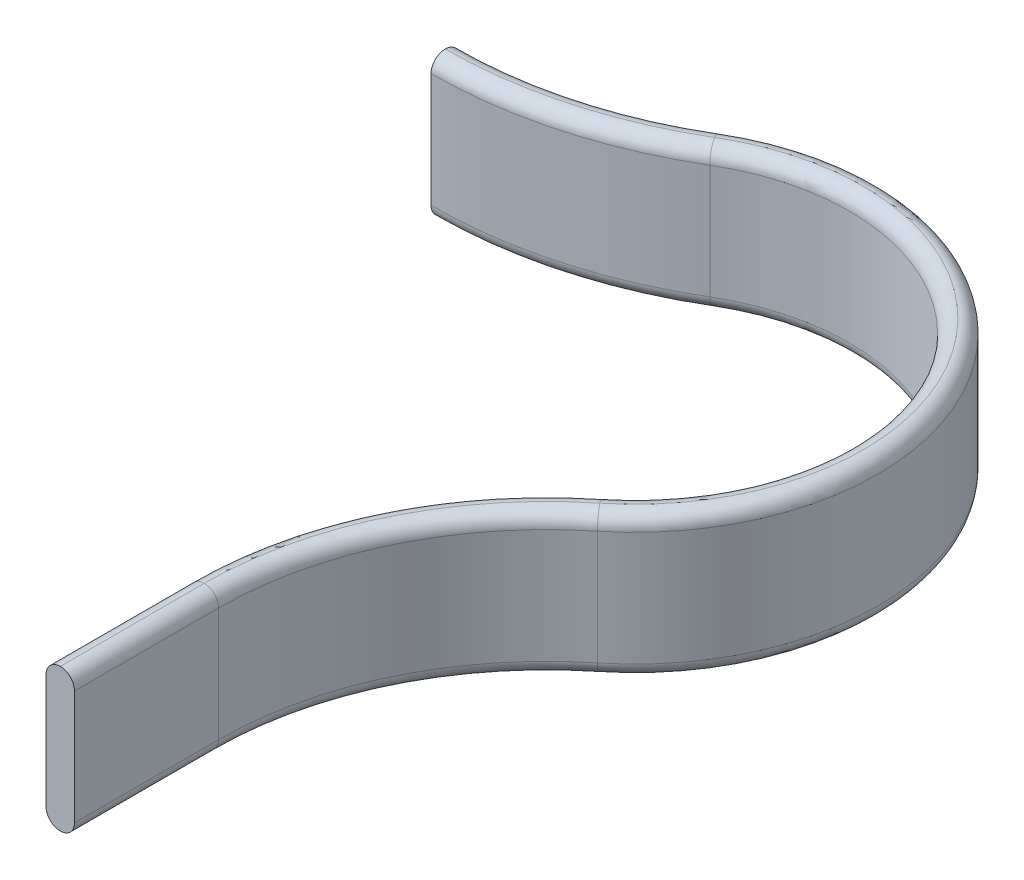
ISO-10303-21;
HEADER;
FILE_DESCRIPTION(('STEP AP214'),'2;1');
FILE_NAME('part.step','',(''),(''),'','','');
FILE_SCHEMA(('AUTOMOTIVE_DESIGN { 1 0 10303 214 1 1 1 1 }'));
ENDSEC;
DATA;
#1=APPLICATION_CONTEXT('core data for automotive mechanical design processes');
#2=APPLICATION_PROTOCOL_DEFINITION('international standard','automotive_design',2000,#1);
#3=PRODUCT_CONTEXT('',#1,'mechanical');
#4=PRODUCT('Part','Part','',(#3));
#5=PRODUCT_RELATED_PRODUCT_CATEGORY('part','',(#4));
#6=PRODUCT_DEFINITION_FORMATION('','',#4);
#7=PRODUCT_DEFINITION_CONTEXT('part definition',#1,'design');
#8=PRODUCT_DEFINITION('design','',#6,#7);
#9=PRODUCT_DEFINITION_SHAPE('','',#8);
#10=(LENGTH_UNIT() NAMED_UNIT(*) SI_UNIT(.MILLI.,.METRE.));
#11=(NAMED_UNIT(*) PLANE_ANGLE_UNIT() SI_UNIT($,.RADIAN.));
#12=(NAMED_UNIT(*) SI_UNIT($,.STERADIAN.) SOLID_ANGLE_UNIT());
#13=UNCERTAINTY_MEASURE_WITH_UNIT(LENGTH_MEASURE(1.E-05),#10,'distance_accuracy_value','');
#14=(GEOMETRIC_REPRESENTATION_CONTEXT(3) GLOBAL_UNCERTAINTY_ASSIGNED_CONTEXT((#13)) GLOBAL_UNIT_ASSIGNED_CONTEXT((#10,
#11,#12)) REPRESENTATION_CONTEXT('',''));
#15=CARTESIAN_POINT('',(0.,0.,0.));
#16=DIRECTION('',(0.,0.,1.));
#17=DIRECTION('',(1.,0.,0.));
#18=AXIS2_PLACEMENT_3D('',#15,#16,#17);
#19=CARTESIAN_POINT('',(50.,10.,79.8062984072389));
#20=DIRECTION('',(0.,-1.,0.));
#21=DIRECTION('',(0.,0.,-1.));
#22=AXIS2_PLACEMENT_3D('',#19,#20,#21);
#23=CYLINDRICAL_SURFACE('',#22,46.);
#24=DIRECTION('',(0.,-1.,0.));
#25=VECTOR('',#24,1.);
#26=CARTESIAN_POINT('',(4.00000000000001,10.,79.8062984072389));
#27=LINE('',#26,#25);
#28=CARTESIAN_POINT('',(4.00000000000001,8.,79.8062984072389));
#29=VERTEX_POINT('',#28);
#30=CARTESIAN_POINT('',(4.00000000000001,-8.,79.8062984072389));
#31=VERTEX_POINT('',#30);
#32=EDGE_CURVE('E146',#29,#31,#27,.T.);
#33=ORIENTED_EDGE('',*,*,#32,.T.);
#34=CARTESIAN_POINT('',(50.,-8.,79.8062984072389));
#35=DIRECTION('',(0.,-1.,0.));
#36=DIRECTION('',(0.,0.,-1.));
#37=AXIS2_PLACEMENT_3D('',#34,#35,#36);
#38=CIRCLE('',#37,46.);
#39=CARTESIAN_POINT('',(21.25,-8.,43.8975599164481));
#40=VERTEX_POINT('',#39);
#41=EDGE_CURVE('E211',#31,#40,#38,.T.);
#42=ORIENTED_EDGE('',*,*,#41,.T.);
#43=DIRECTION('',(0.,-1.,0.));
#44=VECTOR('',#43,1.);
#45=CARTESIAN_POINT('',(21.25,10.,43.8975599164481));
#46=LINE('',#45,#44);
#47=CARTESIAN_POINT('',(21.25,8.,43.8975599164481));
#48=VERTEX_POINT('',#47);
#49=EDGE_CURVE('E267',#48,#40,#46,.T.);
#50=ORIENTED_EDGE('',*,*,#49,.F.);
#51=CARTESIAN_POINT('',(50.,8.,79.8062984072389));
#52=DIRECTION('',(0.,-1.,0.));
#53=DIRECTION('',(0.,0.,-1.));
#54=AXIS2_PLACEMENT_3D('',#51,#52,#53);
#55=CIRCLE('',#54,46.);
#56=EDGE_CURVE('E215',#48,#29,#55,.F.);
#57=ORIENTED_EDGE('',*,*,#56,.T.);
#58=EDGE_LOOP('',(#33,#42,#50,#57));
#59=FACE_BOUND('',#58,.T.);
#60=ADVANCED_FACE('F39',(#59),#23,.F.);
#61=CARTESIAN_POINT('',(0.,10.,17.3563184232549));
#62=DIRECTION('',(0.,-1.,0.));
#63=DIRECTION('',(0.,0.,-1.));
#64=AXIS2_PLACEMENT_3D('',#61,#62,#63);
#65=CYLINDRICAL_SURFACE('',#64,34.);
#66=ORIENTED_EDGE('',*,*,#49,.T.);
#67=CARTESIAN_POINT('',(0.,-8.,17.3563184232549));
#68=DIRECTION('',(0.,-1.,0.));
#69=DIRECTION('',(0.,0.,-1.));
#70=AXIS2_PLACEMENT_3D('',#67,#68,#69);
#71=CIRCLE('',#70,34.);
#72=CARTESIAN_POINT('',(-17.3777777777778,-8.,-11.8671796477525));
#73=VERTEX_POINT('',#72);
#74=EDGE_CURVE('E205',#40,#73,#71,.F.);
#75=ORIENTED_EDGE('',*,*,#74,.T.);
#76=DIRECTION('',(0.,-1.,0.));
#77=VECTOR('',#76,1.);
#78=CARTESIAN_POINT('',(-17.3777777777778,10.,-11.8671796477525));
#79=LINE('',#78,#77);
#80=CARTESIAN_POINT('',(-17.3777777777778,8.,-11.8671796477525));
#81=VERTEX_POINT('',#80);
#82=EDGE_CURVE('E271',#81,#73,#79,.T.);
#83=ORIENTED_EDGE('',*,*,#82,.F.);
#84=CARTESIAN_POINT('',(0.,8.,17.3563184232549));
#85=DIRECTION('',(0.,-1.,0.));
#86=DIRECTION('',(0.,0.,-1.));
#87=AXIS2_PLACEMENT_3D('',#84,#85,#86);
#88=CIRCLE('',#87,34.);
#89=EDGE_CURVE('E101',#81,#48,#88,.T.);
#90=ORIENTED_EDGE('',*,*,#89,.T.);
#91=EDGE_LOOP('',(#66,#75,#83,#90));
#92=FACE_BOUND('',#91,.T.);
#93=ADVANCED_FACE('F412',(#92),#65,.T.);
#94=CARTESIAN_POINT('',(-46.,10.,-60.));
#95=DIRECTION('',(0.,-1.,0.));
#96=DIRECTION('',(0.,0.,-1.));
#97=AXIS2_PLACEMENT_3D('',#94,#95,#96);
#98=CYLINDRICAL_SURFACE('',#97,56.);
#99=ORIENTED_EDGE('',*,*,#82,.T.);
#100=CARTESIAN_POINT('',(-46.,-8.,-60.));
#101=DIRECTION('',(0.,-1.,0.));
#102=DIRECTION('',(0.,0.,-1.));
#103=AXIS2_PLACEMENT_3D('',#100,#101,#102);
#104=CIRCLE('',#103,56.);
#105=CARTESIAN_POINT('',(-46.,-8.,-4.));
#106=VERTEX_POINT('',#105);
#107=EDGE_CURVE('E11',#73,#106,#104,.T.);
#108=ORIENTED_EDGE('',*,*,#107,.T.);
#109=DIRECTION('',(0.,-1.,0.));
#110=VECTOR('',#109,1.);
#111=CARTESIAN_POINT('',(-46.,10.,-4.));
#112=LINE('',#111,#110);
#113=CARTESIAN_POINT('',(-46.,8.,-4.));
#114=VERTEX_POINT('',#113);
#115=EDGE_CURVE('E274',#114,#106,#112,.T.);
#116=ORIENTED_EDGE('',*,*,#115,.F.);
#117=CARTESIAN_POINT('',(-46.,8.,-60.));
#118=DIRECTION('',(0.,-1.,0.));
#119=DIRECTION('',(0.,0.,-1.));
#120=AXIS2_PLACEMENT_3D('',#117,#118,#119);
#121=CIRCLE('',#120,56.);
#122=EDGE_CURVE('E50',#114,#81,#121,.F.);
#123=ORIENTED_EDGE('',*,*,#122,.T.);
#124=EDGE_LOOP('',(#99,#108,#116,#123));
#125=FACE_BOUND('',#124,.T.);
#126=ADVANCED_FACE('F417',(#125),#98,.F.);
#127=CARTESIAN_POINT('',(-46.,10.,-4.));
#128=DIRECTION('',(1.,0.,0.));
#129=DIRECTION('',(0.,0.,-1.));
#130=AXIS2_PLACEMENT_3D('',#127,#128,#129);
#131=PLANE('',#130);
#132=CARTESIAN_POINT('',(-45.9999999999997,-8.,-1.99999999999999));
#133=DIRECTION('',(1.,0.,0.));
#134=DIRECTION('',(0.,0.,-1.));
#135=AXIS2_PLACEMENT_3D('',#132,#133,#134);
#136=CIRCLE('',#135,2.);
#137=CARTESIAN_POINT('',(-46.,-10.,-1.99999999999999));
#138=VERTEX_POINT('',#137);
#139=EDGE_CURVE('E189',#106,#138,#136,.F.);
#140=ORIENTED_EDGE('',*,*,#139,.T.);
#141=CARTESIAN_POINT('',(-45.9999999999997,-8.,-1.99999999999999));
#142=DIRECTION('',(1.,0.,0.));
#143=DIRECTION('',(0.,0.,-1.));
#144=AXIS2_PLACEMENT_3D('',#141,#142,#143);
#145=CIRCLE('',#144,2.);
#146=CARTESIAN_POINT('',(-46.,-8.,0.));
#147=VERTEX_POINT('',#146);
#148=EDGE_CURVE('E185',#138,#147,#145,.F.);
#149=ORIENTED_EDGE('',*,*,#148,.T.);
#150=DIRECTION('',(0.,-1.,0.));
#151=VECTOR('',#150,1.);
#152=CARTESIAN_POINT('',(-46.,10.,0.));
#153=LINE('',#152,#151);
#154=CARTESIAN_POINT('',(-46.,8.,0.));
#155=VERTEX_POINT('',#154);
#156=EDGE_CURVE('E277',#155,#147,#153,.T.);
#157=ORIENTED_EDGE('',*,*,#156,.F.);
#158=CARTESIAN_POINT('',(-45.9999999999997,8.,-1.99999999999999));
#159=DIRECTION('',(1.,0.,0.));
#160=DIRECTION('',(0.,0.,-1.));
#161=AXIS2_PLACEMENT_3D('',#158,#159,#160);
#162=CIRCLE('',#161,2.);
#163=CARTESIAN_POINT('',(-46.,10.,-1.99999999999999));
#164=VERTEX_POINT('',#163);
#165=EDGE_CURVE('E193',#155,#164,#162,.F.);
#166=ORIENTED_EDGE('',*,*,#165,.T.);
#167=CARTESIAN_POINT('',(-45.9999999999997,8.,-1.99999999999999));
#168=DIRECTION('',(1.,0.,0.));
#169=DIRECTION('',(0.,0.,-1.));
#170=AXIS2_PLACEMENT_3D('',#167,#168,#169);
#171=CIRCLE('',#170,2.);
#172=EDGE_CURVE('E93',#164,#114,#171,.F.);
#173=ORIENTED_EDGE('',*,*,#172,.T.);
#174=ORIENTED_EDGE('',*,*,#115,.T.);
#175=EDGE_LOOP('',(#140,#149,#157,#166,#173,#174));
#176=FACE_BOUND('',#175,.T.);
#177=ADVANCED_FACE('F368',(#176),#131,.F.);
#178=CARTESIAN_POINT('',(-46.,10.,-60.));
#179=DIRECTION('',(0.,-1.,0.));
#180=DIRECTION('',(0.,0.,-1.));
#181=AXIS2_PLACEMENT_3D('',#178,#179,#180);
#182=CYLINDRICAL_SURFACE('',#181,60.);
#183=ORIENTED_EDGE('',*,*,#156,.T.);
#184=CARTESIAN_POINT('',(-46.,-8.,-60.));
#185=DIRECTION('',(0.,-1.,0.));
#186=DIRECTION('',(0.,0.,-1.));
#187=AXIS2_PLACEMENT_3D('',#184,#185,#186);
#188=CIRCLE('',#187,60.);
#189=CARTESIAN_POINT('',(-15.3333333333333,-8.,-8.42912105116342));
#190=VERTEX_POINT('',#189);
#191=EDGE_CURVE('E199',#147,#190,#188,.F.);
#192=ORIENTED_EDGE('',*,*,#191,.T.);
#193=DIRECTION('',(0.,-1.,0.));
#194=VECTOR('',#193,1.);
#195=CARTESIAN_POINT('',(-15.3333333333333,10.,-8.42912105116342));
#196=LINE('',#195,#194);
#197=CARTESIAN_POINT('',(-15.3333333333333,8.,-8.42912105116342));
#198=VERTEX_POINT('',#197);
#199=EDGE_CURVE('E281',#198,#190,#196,.T.);
#200=ORIENTED_EDGE('',*,*,#199,.F.);
#201=CARTESIAN_POINT('',(-46.,8.,-60.));
#202=DIRECTION('',(0.,-1.,0.));
#203=DIRECTION('',(0.,0.,-1.));
#204=AXIS2_PLACEMENT_3D('',#201,#202,#203);
#205=CIRCLE('',#204,60.);
#206=EDGE_CURVE('E109',#198,#155,#205,.T.);
#207=ORIENTED_EDGE('',*,*,#206,.T.);
#208=EDGE_LOOP('',(#183,#192,#200,#207));
#209=FACE_BOUND('',#208,.T.);
#210=ADVANCED_FACE('F372',(#209),#182,.T.);
#211=CARTESIAN_POINT('',(0.,10.,17.3563184232549));
#212=DIRECTION('',(0.,-1.,0.));
#213=DIRECTION('',(0.,0.,-1.));
#214=AXIS2_PLACEMENT_3D('',#211,#212,#213);
#215=CYLINDRICAL_SURFACE('',#214,30.);
#216=ORIENTED_EDGE('',*,*,#199,.T.);
#217=CARTESIAN_POINT('',(0.,-8.,17.3563184232549));
#218=DIRECTION('',(0.,-1.,0.));
#219=DIRECTION('',(0.,0.,-1.));
#220=AXIS2_PLACEMENT_3D('',#217,#218,#219);
#221=CIRCLE('',#220,30.);
#222=CARTESIAN_POINT('',(18.75,-8.,40.7750609172489));
#223=VERTEX_POINT('',#222);
#224=EDGE_CURVE('E227',#190,#223,#221,.T.);
#225=ORIENTED_EDGE('',*,*,#224,.T.);
#226=DIRECTION('',(0.,-1.,0.));
#227=VECTOR('',#226,1.);
#228=CARTESIAN_POINT('',(18.75,10.,40.7750609172489));
#229=LINE('',#228,#227);
#230=CARTESIAN_POINT('',(18.75,8.,40.7750609172489));
#231=VERTEX_POINT('',#230);
#232=EDGE_CURVE('E285',#231,#223,#229,.T.);
#233=ORIENTED_EDGE('',*,*,#232,.F.);
#234=CARTESIAN_POINT('',(0.,8.,17.3563184232549));
#235=DIRECTION('',(0.,-1.,0.));
#236=DIRECTION('',(0.,0.,-1.));
#237=AXIS2_PLACEMENT_3D('',#234,#235,#236);
#238=CIRCLE('',#237,30.);
#239=EDGE_CURVE('E231',#231,#198,#238,.F.);
#240=ORIENTED_EDGE('',*,*,#239,.T.);
#241=EDGE_LOOP('',(#216,#225,#233,#240));
#242=FACE_BOUND('',#241,.T.);
#243=ADVANCED_FACE('F385',(#242),#215,.F.);
#244=CARTESIAN_POINT('',(50.,10.,79.8062984072389));
#245=DIRECTION('',(0.,-1.,0.));
#246=DIRECTION('',(0.,0.,-1.));
#247=AXIS2_PLACEMENT_3D('',#244,#245,#246);
#248=CYLINDRICAL_SURFACE('',#247,50.);
#249=ORIENTED_EDGE('',*,*,#232,.T.);
#250=CARTESIAN_POINT('',(50.,-8.,79.8062984072389));
#251=DIRECTION('',(0.,-1.,0.));
#252=DIRECTION('',(0.,0.,-1.));
#253=AXIS2_PLACEMENT_3D('',#250,#251,#252);
#254=CIRCLE('',#253,50.);
#255=CARTESIAN_POINT('',(0.,-8.,79.8062984072389));
#256=VERTEX_POINT('',#255);
#257=EDGE_CURVE('E235',#223,#256,#254,.F.);
#258=ORIENTED_EDGE('',*,*,#257,.T.);
#259=DIRECTION('',(0.,-1.,0.));
#260=VECTOR('',#259,1.);
#261=CARTESIAN_POINT('',(0.,10.,79.8062984072389));
#262=LINE('',#261,#260);
#263=CARTESIAN_POINT('',(0.,8.,79.8062984072389));
#264=VERTEX_POINT('',#263);
#265=EDGE_CURVE('E289',#264,#256,#262,.T.);
#266=ORIENTED_EDGE('',*,*,#265,.F.);
#267=CARTESIAN_POINT('',(50.,8.,79.8062984072389));
#268=DIRECTION('',(0.,-1.,0.));
#269=DIRECTION('',(0.,0.,-1.));
#270=AXIS2_PLACEMENT_3D('',#267,#268,#269);
#271=CIRCLE('',#270,50.);
#272=EDGE_CURVE('E239',#264,#231,#271,.T.);
#273=ORIENTED_EDGE('',*,*,#272,.T.);
#274=EDGE_LOOP('',(#249,#258,#266,#273));
#275=FACE_BOUND('',#274,.T.);
#276=ADVANCED_FACE('F386',(#275),#248,.T.);
#277=CARTESIAN_POINT('',(0.,10.,79.8062984072389));
#278=DIRECTION('',(1.,0.,0.));
#279=DIRECTION('',(0.,0.,-1.));
#280=AXIS2_PLACEMENT_3D('',#277,#278,#279);
#281=PLANE('',#280);
#282=ORIENTED_EDGE('',*,*,#265,.T.);
#283=DIRECTION('',(0.,0.,1.));
#284=VECTOR('',#283,1.);
#285=CARTESIAN_POINT('',(0.,-8.,100.));
#286=LINE('',#285,#284);
#287=CARTESIAN_POINT('',(0.,-8.,100.));
#288=VERTEX_POINT('',#287);
#289=EDGE_CURVE('E259',#256,#288,#286,.T.);
#290=ORIENTED_EDGE('',*,*,#289,.T.);
#291=DIRECTION('',(0.,-1.,0.));
#292=VECTOR('',#291,1.);
#293=CARTESIAN_POINT('',(0.,10.,100.));
#294=LINE('',#293,#292);
#295=CARTESIAN_POINT('',(0.,8.,100.));
#296=VERTEX_POINT('',#295);
#297=EDGE_CURVE('E293',#296,#288,#294,.T.);
#298=ORIENTED_EDGE('',*,*,#297,.F.);
#299=DIRECTION('',(0.,0.,1.));
#300=VECTOR('',#299,1.);
#301=CARTESIAN_POINT('',(0.,8.,79.8062984072389));
#302=LINE('',#301,#300);
#303=EDGE_CURVE('E263',#296,#264,#302,.F.);
#304=ORIENTED_EDGE('',*,*,#303,.T.);
#305=EDGE_LOOP('',(#282,#290,#298,#304));
#306=FACE_BOUND('',#305,.T.);
#307=ADVANCED_FACE('F394',(#306),#281,.F.);
#308=CARTESIAN_POINT('',(0.,10.,100.));
#309=DIRECTION('',(0.,0.,-1.));
#310=DIRECTION('',(-1.,0.,0.));
#311=AXIS2_PLACEMENT_3D('',#308,#309,#310);
#312=PLANE('',#311);
#313=ORIENTED_EDGE('',*,*,#297,.T.);
#314=CARTESIAN_POINT('',(2.00000000000001,-8.,100.));
#315=DIRECTION('',(0.,0.,-1.));
#316=DIRECTION('',(-1.,0.,0.));
#317=AXIS2_PLACEMENT_3D('',#314,#315,#316);
#318=CIRCLE('',#317,2.);
#319=CARTESIAN_POINT('',(2.00000000000001,-10.,100.));
#320=VERTEX_POINT('',#319);
#321=EDGE_CURVE('E243',#288,#320,#318,.F.);
#322=ORIENTED_EDGE('',*,*,#321,.T.);
#323=CARTESIAN_POINT('',(2.00000000000001,-8.,100.));
#324=DIRECTION('',(0.,0.,-1.));
#325=DIRECTION('',(-1.,0.,0.));
#326=AXIS2_PLACEMENT_3D('',#323,#324,#325);
#327=CIRCLE('',#326,2.);
#328=CARTESIAN_POINT('',(4.00000000000001,-8.,100.));
#329=VERTEX_POINT('',#328);
#330=EDGE_CURVE('E247',#320,#329,#327,.F.);
#331=ORIENTED_EDGE('',*,*,#330,.T.);
#332=DIRECTION('',(0.,-1.,0.));
#333=VECTOR('',#332,1.);
#334=CARTESIAN_POINT('',(4.00000000000001,10.,100.));
#335=LINE('',#334,#333);
#336=CARTESIAN_POINT('',(4.00000000000001,8.,100.));
#337=VERTEX_POINT('',#336);
#338=EDGE_CURVE('E297',#337,#329,#335,.T.);
#339=ORIENTED_EDGE('',*,*,#338,.F.);
#340=CARTESIAN_POINT('',(2.00000000000001,8.,100.));
#341=DIRECTION('',(0.,0.,-1.));
#342=DIRECTION('',(-1.,0.,0.));
#343=AXIS2_PLACEMENT_3D('',#340,#341,#342);
#344=CIRCLE('',#343,2.);
#345=CARTESIAN_POINT('',(2.00000000000001,10.,100.));
#346=VERTEX_POINT('',#345);
#347=EDGE_CURVE('E255',#337,#346,#344,.F.);
#348=ORIENTED_EDGE('',*,*,#347,.T.);
#349=CARTESIAN_POINT('',(2.00000000000001,8.,100.));
#350=DIRECTION('',(0.,0.,-1.));
#351=DIRECTION('',(-1.,0.,0.));
#352=AXIS2_PLACEMENT_3D('',#349,#350,#351);
#353=CIRCLE('',#352,2.);
#354=EDGE_CURVE('E251',#346,#296,#353,.F.);
#355=ORIENTED_EDGE('',*,*,#354,.T.);
#356=EDGE_LOOP('',(#313,#322,#331,#339,#348,#355));
#357=FACE_BOUND('',#356,.T.);
#358=ADVANCED_FACE('F400',(#357),#312,.F.);
#359=CARTESIAN_POINT('',(4.00000000000001,10.,79.8062984072389));
#360=DIRECTION('',(-1.,0.,0.));
#361=DIRECTION('',(0.,0.,1.));
#362=AXIS2_PLACEMENT_3D('',#359,#360,#361);
#363=PLANE('',#362);
#364=ORIENTED_EDGE('',*,*,#338,.T.);
#365=DIRECTION('',(0.,0.,-1.));
#366=VECTOR('',#365,1.);
#367=CARTESIAN_POINT('',(4.00000000000001,-8.,79.8062984072389));
#368=LINE('',#367,#366);
#369=EDGE_CURVE('E219',#329,#31,#368,.T.);
#370=ORIENTED_EDGE('',*,*,#369,.T.);
#371=ORIENTED_EDGE('',*,*,#32,.F.);
#372=DIRECTION('',(0.,0.,-1.));
#373=VECTOR('',#372,1.);
#374=CARTESIAN_POINT('',(4.00000000000001,8.,79.8062984072389));
#375=LINE('',#374,#373);
#376=EDGE_CURVE('E223',#29,#337,#375,.F.);
#377=ORIENTED_EDGE('',*,*,#376,.T.);
#378=EDGE_LOOP('',(#364,#370,#371,#377));
#379=FACE_BOUND('',#378,.T.);
#380=ADVANCED_FACE('F402',(#379),#363,.F.);
#381=CARTESIAN_POINT('',(-46.,-8.,-60.));
#382=DIRECTION('',(0.,-1.,0.));
#383=DIRECTION('',(0.,0.,-1.));
#384=AXIS2_PLACEMENT_3D('',#381,#382,#383);
#385=TOROIDAL_SURFACE('',#384,58.,2.);
#386=ORIENTED_EDGE('',*,*,#139,.F.);
#387=ORIENTED_EDGE('',*,*,#107,.F.);
#388=CARTESIAN_POINT('',(-16.3555555555555,-8.,-10.148150349458));
#389=DIRECTION('',(0.859514649147276,0.,-0.511111111111111));
#390=DIRECTION('',(-0.511111111111111,0.,-0.859514649147276));
#391=AXIS2_PLACEMENT_3D('',#388,#389,#390);
#392=CIRCLE('',#391,2.);
#393=CARTESIAN_POINT('',(-16.3555555555556,-10.,-10.148150349458));
#394=VERTEX_POINT('',#393);
#395=EDGE_CURVE('E142',#394,#73,#392,.T.);
#396=ORIENTED_EDGE('',*,*,#395,.F.);
#397=CARTESIAN_POINT('',(-46.,-10.,-60.));
#398=DIRECTION('',(0.,-1.,0.));
#399=DIRECTION('',(0.,0.,-1.));
#400=AXIS2_PLACEMENT_3D('',#397,#398,#399);
#401=CIRCLE('',#400,58.);
#402=EDGE_CURVE('E147',#138,#394,#401,.F.);
#403=ORIENTED_EDGE('',*,*,#402,.F.);
#404=EDGE_LOOP('',(#386,#387,#396,#403));
#405=FACE_BOUND('',#404,.T.);
#406=ADVANCED_FACE('F408',(#405),#385,.T.);
#407=CARTESIAN_POINT('',(0.,-8.,17.3563184232549));
#408=DIRECTION('',(0.,-1.,0.));
#409=DIRECTION('',(0.,0.,-1.));
#410=AXIS2_PLACEMENT_3D('',#407,#408,#409);
#411=TOROIDAL_SURFACE('',#410,32.,2.);
#412=ORIENTED_EDGE('',*,*,#395,.T.);
#413=ORIENTED_EDGE('',*,*,#74,.F.);
#414=CARTESIAN_POINT('',(20.,-8.,42.3363104168485));
#415=DIRECTION('',(-0.780624749799799,0.,0.625000000000001));
#416=DIRECTION('',(0.625000000000001,0.,0.780624749799799));
#417=AXIS2_PLACEMENT_3D('',#414,#415,#416);
#418=CIRCLE('',#417,2.);
#419=CARTESIAN_POINT('',(20.,-10.,42.3363104168485));
#420=VERTEX_POINT('',#419);
#421=EDGE_CURVE('E151',#420,#40,#418,.T.);
#422=ORIENTED_EDGE('',*,*,#421,.F.);
#423=CARTESIAN_POINT('',(0.,-10.,17.3563184232549));
#424=DIRECTION('',(0.,-1.,0.));
#425=DIRECTION('',(0.,0.,-1.));
#426=AXIS2_PLACEMENT_3D('',#423,#424,#425);
#427=CIRCLE('',#426,32.);
#428=EDGE_CURVE('E155',#394,#420,#427,.T.);
#429=ORIENTED_EDGE('',*,*,#428,.F.);
#430=EDGE_LOOP('',(#412,#413,#422,#429));
#431=FACE_BOUND('',#430,.T.);
#432=ADVANCED_FACE('F434',(#431),#411,.T.);
#433=CARTESIAN_POINT('',(-46.,-8.,-60.));
#434=DIRECTION('',(0.,-1.,0.));
#435=DIRECTION('',(0.,0.,-1.));
#436=AXIS2_PLACEMENT_3D('',#433,#434,#435);
#437=TOROIDAL_SURFACE('',#436,58.,2.);
#438=ORIENTED_EDGE('',*,*,#148,.F.);
#439=ORIENTED_EDGE('',*,*,#402,.T.);
#440=CARTESIAN_POINT('',(-16.3555555555556,-8.,-10.148150349458));
#441=DIRECTION('',(0.859514649147276,0.,-0.511111111111111));
#442=DIRECTION('',(-0.511111111111111,0.,-0.859514649147276));
#443=AXIS2_PLACEMENT_3D('',#440,#441,#442);
#444=CIRCLE('',#443,2.);
#445=EDGE_CURVE('E159',#190,#394,#444,.T.);
#446=ORIENTED_EDGE('',*,*,#445,.F.);
#447=ORIENTED_EDGE('',*,*,#191,.F.);
#448=EDGE_LOOP('',(#438,#439,#446,#447));
#449=FACE_BOUND('',#448,.T.);
#450=ADVANCED_FACE('F376',(#449),#437,.T.);
#451=CARTESIAN_POINT('',(50.,-8.,79.8062984072389));
#452=DIRECTION('',(0.,-1.,0.));
#453=DIRECTION('',(0.,0.,-1.));
#454=AXIS2_PLACEMENT_3D('',#451,#452,#453);
#455=TOROIDAL_SURFACE('',#454,48.,2.);
#456=ORIENTED_EDGE('',*,*,#421,.T.);
#457=ORIENTED_EDGE('',*,*,#41,.F.);
#458=CARTESIAN_POINT('',(2.00000000000001,-8.,79.8062984072389));
#459=DIRECTION('',(0.,0.,1.));
#460=DIRECTION('',(1.,0.,0.));
#461=AXIS2_PLACEMENT_3D('',#458,#459,#460);
#462=CIRCLE('',#461,2.);
#463=CARTESIAN_POINT('',(2.00000000000001,-10.,79.8062984072389));
#464=VERTEX_POINT('',#463);
#465=EDGE_CURVE('E163',#464,#31,#462,.T.);
#466=ORIENTED_EDGE('',*,*,#465,.F.);
#467=CARTESIAN_POINT('',(50.,-10.,79.8062984072389));
#468=DIRECTION('',(0.,-1.,0.));
#469=DIRECTION('',(0.,0.,-1.));
#470=AXIS2_PLACEMENT_3D('',#467,#468,#469);
#471=CIRCLE('',#470,48.);
#472=EDGE_CURVE('E167',#420,#464,#471,.F.);
#473=ORIENTED_EDGE('',*,*,#472,.F.);
#474=EDGE_LOOP('',(#456,#457,#466,#473));
#475=FACE_BOUND('',#474,.T.);
#476=ADVANCED_FACE('F316',(#475),#455,.T.);
#477=CARTESIAN_POINT('',(0.,-8.,17.3563184232549));
#478=DIRECTION('',(0.,-1.,0.));
#479=DIRECTION('',(0.,0.,-1.));
#480=AXIS2_PLACEMENT_3D('',#477,#478,#479);
#481=TOROIDAL_SURFACE('',#480,32.,2.);
#482=ORIENTED_EDGE('',*,*,#445,.T.);
#483=ORIENTED_EDGE('',*,*,#428,.T.);
#484=CARTESIAN_POINT('',(20.,-8.,42.3363104168485));
#485=DIRECTION('',(-0.780624749799799,0.,0.625000000000001));
#486=DIRECTION('',(0.625000000000001,0.,0.780624749799799));
#487=AXIS2_PLACEMENT_3D('',#484,#485,#486);
#488=CIRCLE('',#487,2.);
#489=EDGE_CURVE('E171',#223,#420,#488,.T.);
#490=ORIENTED_EDGE('',*,*,#489,.F.);
#491=ORIENTED_EDGE('',*,*,#224,.F.);
#492=EDGE_LOOP('',(#482,#483,#490,#491));
#493=FACE_BOUND('',#492,.T.);
#494=ADVANCED_FACE('F382',(#493),#481,.T.);
#495=CARTESIAN_POINT('',(2.00000000000001,-8.,79.8062984072389));
#496=DIRECTION('',(0.,0.,1.));
#497=DIRECTION('',(1.,0.,0.));
#498=AXIS2_PLACEMENT_3D('',#495,#496,#497);
#499=CYLINDRICAL_SURFACE('',#498,2.);
#500=ORIENTED_EDGE('',*,*,#369,.F.);
#501=ORIENTED_EDGE('',*,*,#330,.F.);
#502=DIRECTION('',(0.,0.,-1.));
#503=VECTOR('',#502,1.);
#504=CARTESIAN_POINT('',(2.00000000000001,-10.,100.));
#505=LINE('',#504,#503);
#506=EDGE_CURVE('E175',#464,#320,#505,.F.);
#507=ORIENTED_EDGE('',*,*,#506,.F.);
#508=ORIENTED_EDGE('',*,*,#465,.T.);
#509=EDGE_LOOP('',(#500,#501,#507,#508));
#510=FACE_BOUND('',#509,.T.);
#511=ADVANCED_FACE('F321',(#510),#499,.T.);
#512=CARTESIAN_POINT('',(50.,-8.,79.8062984072389));
#513=DIRECTION('',(0.,-1.,0.));
#514=DIRECTION('',(0.,0.,-1.));
#515=AXIS2_PLACEMENT_3D('',#512,#513,#514);
#516=TOROIDAL_SURFACE('',#515,48.,2.);
#517=ORIENTED_EDGE('',*,*,#489,.T.);
#518=ORIENTED_EDGE('',*,*,#472,.T.);
#519=CARTESIAN_POINT('',(2.00000000000001,-8.,79.8062984072389));
#520=DIRECTION('',(0.,0.,1.));
#521=DIRECTION('',(1.,0.,0.));
#522=AXIS2_PLACEMENT_3D('',#519,#520,#521);
#523=CIRCLE('',#522,2.);
#524=EDGE_CURVE('E98',#256,#464,#523,.T.);
#525=ORIENTED_EDGE('',*,*,#524,.F.);
#526=ORIENTED_EDGE('',*,*,#257,.F.);
#527=EDGE_LOOP('',(#517,#518,#525,#526));
#528=FACE_BOUND('',#527,.T.);
#529=ADVANCED_FACE('F333',(#528),#516,.T.);
#530=CARTESIAN_POINT('',(2.00000000000001,-8.,79.8062984072389));
#531=DIRECTION('',(0.,0.,-1.));
#532=DIRECTION('',(-1.,0.,0.));
#533=AXIS2_PLACEMENT_3D('',#530,#531,#532);
#534=CYLINDRICAL_SURFACE('',#533,2.);
#535=ORIENTED_EDGE('',*,*,#524,.T.);
#536=ORIENTED_EDGE('',*,*,#506,.T.);
#537=ORIENTED_EDGE('',*,*,#321,.F.);
#538=ORIENTED_EDGE('',*,*,#289,.F.);
#539=EDGE_LOOP('',(#535,#536,#537,#538));
#540=FACE_BOUND('',#539,.T.);
#541=ADVANCED_FACE('F329',(#540),#534,.T.);
#542=CARTESIAN_POINT('',(-46.,8.,-60.));
#543=DIRECTION('',(0.,-1.,0.));
#544=DIRECTION('',(0.,0.,-1.));
#545=AXIS2_PLACEMENT_3D('',#542,#543,#544);
#546=TOROIDAL_SURFACE('',#545,58.,2.);
#547=ORIENTED_EDGE('',*,*,#122,.F.);
#548=ORIENTED_EDGE('',*,*,#172,.F.);
#549=CARTESIAN_POINT('',(-46.,10.,-60.));
#550=DIRECTION('',(0.,-1.,0.));
#551=DIRECTION('',(0.,0.,-1.));
#552=AXIS2_PLACEMENT_3D('',#549,#550,#551);
#553=CIRCLE('',#552,58.);
#554=CARTESIAN_POINT('',(-16.3555555555555,10.,-10.148150349458));
#555=VERTEX_POINT('',#554);
#556=EDGE_CURVE('E43',#555,#164,#553,.T.);
#557=ORIENTED_EDGE('',*,*,#556,.F.);
#558=CARTESIAN_POINT('',(-16.3555555555555,8.,-10.148150349458));
#559=DIRECTION('',(0.859514649147276,0.,-0.511111111111111));
#560=DIRECTION('',(-0.511111111111111,0.,-0.859514649147276));
#561=AXIS2_PLACEMENT_3D('',#558,#559,#560);
#562=CIRCLE('',#561,2.);
#563=EDGE_CURVE('E91',#81,#555,#562,.T.);
#564=ORIENTED_EDGE('',*,*,#563,.F.);
#565=EDGE_LOOP('',(#547,#548,#557,#564));
#566=FACE_BOUND('',#565,.T.);
#567=ADVANCED_FACE('F41',(#566),#546,.T.);
#568=CARTESIAN_POINT('',(-46.,8.,-60.));
#569=DIRECTION('',(0.,-1.,0.));
#570=DIRECTION('',(0.,0.,-1.));
#571=AXIS2_PLACEMENT_3D('',#568,#569,#570);
#572=TOROIDAL_SURFACE('',#571,58.,2.);
#573=ORIENTED_EDGE('',*,*,#165,.F.);
#574=ORIENTED_EDGE('',*,*,#206,.F.);
#575=CARTESIAN_POINT('',(-16.3555555555556,8.,-10.148150349458));
#576=DIRECTION('',(0.859514649147277,0.,-0.511111111111111));
#577=DIRECTION('',(-0.511111111111111,0.,-0.859514649147277));
#578=AXIS2_PLACEMENT_3D('',#575,#576,#577);
#579=CIRCLE('',#578,2.);
#580=EDGE_CURVE('E103',#555,#198,#579,.T.);
#581=ORIENTED_EDGE('',*,*,#580,.F.);
#582=ORIENTED_EDGE('',*,*,#556,.T.);
#583=EDGE_LOOP('',(#573,#574,#581,#582));
#584=FACE_BOUND('',#583,.T.);
#585=ADVANCED_FACE('F106',(#584),#572,.T.);
#586=CARTESIAN_POINT('',(0.,8.,17.3563184232549));
#587=DIRECTION('',(0.,-1.,0.));
#588=DIRECTION('',(0.,0.,-1.));
#589=AXIS2_PLACEMENT_3D('',#586,#587,#588);
#590=TOROIDAL_SURFACE('',#589,32.,2.);
#591=ORIENTED_EDGE('',*,*,#89,.F.);
#592=ORIENTED_EDGE('',*,*,#563,.T.);
#593=CARTESIAN_POINT('',(0.,10.,17.3563184232549));
#594=DIRECTION('',(0.,-1.,0.));
#595=DIRECTION('',(0.,0.,-1.));
#596=AXIS2_PLACEMENT_3D('',#593,#594,#595);
#597=CIRCLE('',#596,32.);
#598=CARTESIAN_POINT('',(20.,10.,42.3363104168485));
#599=VERTEX_POINT('',#598);
#600=EDGE_CURVE('E82',#599,#555,#597,.F.);
#601=ORIENTED_EDGE('',*,*,#600,.F.);
#602=CARTESIAN_POINT('',(20.,8.,42.3363104168485));
#603=DIRECTION('',(-0.780624749799799,0.,0.625000000000001));
#604=DIRECTION('',(0.625000000000001,0.,0.780624749799799));
#605=AXIS2_PLACEMENT_3D('',#602,#603,#604);
#606=CIRCLE('',#605,2.);
#607=EDGE_CURVE('E120',#48,#599,#606,.T.);
#608=ORIENTED_EDGE('',*,*,#607,.F.);
#609=EDGE_LOOP('',(#591,#592,#601,#608));
#610=FACE_BOUND('',#609,.T.);
#611=ADVANCED_FACE('F99',(#610),#590,.T.);
#612=CARTESIAN_POINT('',(0.,8.,17.3563184232549));
#613=DIRECTION('',(0.,-1.,0.));
#614=DIRECTION('',(0.,0.,-1.));
#615=AXIS2_PLACEMENT_3D('',#612,#613,#614);
#616=TOROIDAL_SURFACE('',#615,32.,2.);
#617=ORIENTED_EDGE('',*,*,#580,.T.);
#618=ORIENTED_EDGE('',*,*,#239,.F.);
#619=CARTESIAN_POINT('',(20.,8.,42.3363104168485));
#620=DIRECTION('',(-0.780624749799801,0.,0.624999999999999));
#621=DIRECTION('',(0.624999999999999,0.,0.780624749799801));
#622=AXIS2_PLACEMENT_3D('',#619,#620,#621);
#623=CIRCLE('',#622,2.);
#624=EDGE_CURVE('E117',#599,#231,#623,.T.);
#625=ORIENTED_EDGE('',*,*,#624,.F.);
#626=ORIENTED_EDGE('',*,*,#600,.T.);
#627=EDGE_LOOP('',(#617,#618,#625,#626));
#628=FACE_BOUND('',#627,.T.);
#629=ADVANCED_FACE('F115',(#628),#616,.T.);
#630=CARTESIAN_POINT('',(50.,8.,79.8062984072389));
#631=DIRECTION('',(0.,-1.,0.));
#632=DIRECTION('',(0.,0.,-1.));
#633=AXIS2_PLACEMENT_3D('',#630,#631,#632);
#634=TOROIDAL_SURFACE('',#633,48.,2.);
#635=ORIENTED_EDGE('',*,*,#56,.F.);
#636=ORIENTED_EDGE('',*,*,#607,.T.);
#637=CARTESIAN_POINT('',(50.,10.,79.8062984072389));
#638=DIRECTION('',(0.,-1.,0.));
#639=DIRECTION('',(0.,0.,-1.));
#640=AXIS2_PLACEMENT_3D('',#637,#638,#639);
#641=CIRCLE('',#640,48.);
#642=CARTESIAN_POINT('',(2.00000000000001,10.,79.8062984072389));
#643=VERTEX_POINT('',#642);
#644=EDGE_CURVE('E127',#643,#599,#641,.T.);
#645=ORIENTED_EDGE('',*,*,#644,.F.);
#646=CARTESIAN_POINT('',(2.00000000000001,8.,79.8062984072389));
#647=DIRECTION('',(0.,0.,1.));
#648=DIRECTION('',(1.,0.,0.));
#649=AXIS2_PLACEMENT_3D('',#646,#647,#648);
#650=CIRCLE('',#649,2.);
#651=EDGE_CURVE('E130',#29,#643,#650,.T.);
#652=ORIENTED_EDGE('',*,*,#651,.F.);
#653=EDGE_LOOP('',(#635,#636,#645,#652));
#654=FACE_BOUND('',#653,.T.);
#655=ADVANCED_FACE('F449',(#654),#634,.T.);
#656=CARTESIAN_POINT('',(50.,8.,79.8062984072389));
#657=DIRECTION('',(0.,-1.,0.));
#658=DIRECTION('',(0.,0.,-1.));
#659=AXIS2_PLACEMENT_3D('',#656,#657,#658);
#660=TOROIDAL_SURFACE('',#659,48.,2.);
#661=ORIENTED_EDGE('',*,*,#624,.T.);
#662=ORIENTED_EDGE('',*,*,#272,.F.);
#663=CARTESIAN_POINT('',(2.00000000000001,8.,79.8062984072389));
#664=DIRECTION('',(0.,0.,1.));
#665=DIRECTION('',(1.,0.,0.));
#666=AXIS2_PLACEMENT_3D('',#663,#664,#665);
#667=CIRCLE('',#666,2.);
#668=EDGE_CURVE('E134',#643,#264,#667,.T.);
#669=ORIENTED_EDGE('',*,*,#668,.F.);
#670=ORIENTED_EDGE('',*,*,#644,.T.);
#671=EDGE_LOOP('',(#661,#662,#669,#670));
#672=FACE_BOUND('',#671,.T.);
#673=ADVANCED_FACE('F390',(#672),#660,.T.);
#674=CARTESIAN_POINT('',(2.00000000000001,8.,79.8062984072389));
#675=DIRECTION('',(0.,0.,-1.));
#676=DIRECTION('',(-1.,0.,0.));
#677=AXIS2_PLACEMENT_3D('',#674,#675,#676);
#678=CYLINDRICAL_SURFACE('',#677,2.);
#679=ORIENTED_EDGE('',*,*,#376,.F.);
#680=ORIENTED_EDGE('',*,*,#651,.T.);
#681=DIRECTION('',(0.,0.,-1.));
#682=VECTOR('',#681,1.);
#683=CARTESIAN_POINT('',(2.00000000000001,10.,79.8062984072389));
#684=LINE('',#683,#682);
#685=EDGE_CURVE('E138',#346,#643,#684,.T.);
#686=ORIENTED_EDGE('',*,*,#685,.F.);
#687=ORIENTED_EDGE('',*,*,#347,.F.);
#688=EDGE_LOOP('',(#679,#680,#686,#687));
#689=FACE_BOUND('',#688,.T.);
#690=ADVANCED_FACE('F443',(#689),#678,.T.);
#691=CARTESIAN_POINT('',(2.00000000000001,8.,79.8062984072389));
#692=DIRECTION('',(0.,0.,1.));
#693=DIRECTION('',(1.,0.,0.));
#694=AXIS2_PLACEMENT_3D('',#691,#692,#693);
#695=CYLINDRICAL_SURFACE('',#694,2.);
#696=ORIENTED_EDGE('',*,*,#668,.T.);
#697=ORIENTED_EDGE('',*,*,#303,.F.);
#698=ORIENTED_EDGE('',*,*,#354,.F.);
#699=ORIENTED_EDGE('',*,*,#685,.T.);
#700=EDGE_LOOP('',(#696,#697,#698,#699));
#701=FACE_BOUND('',#700,.T.);
#702=ADVANCED_FACE('F397',(#701),#695,.T.);
#703=CLOSED_SHELL('',(#60,#93,#126,#177,#210,#243,#276,#307,#358,#380,#406,#432,#450,#476,#494,
#511,#529,#541,#567,#585,#611,#629,#655,#673,#690,#702));
#704=MANIFOLD_SOLID_BREP('B2',#703);
#705=ADVANCED_BREP_SHAPE_REPRESENTATION('',(#18,#704),#14);
#706=SHAPE_DEFINITION_REPRESENTATION(#9,#705);
ENDSEC;
END-ISO-10303-21;
